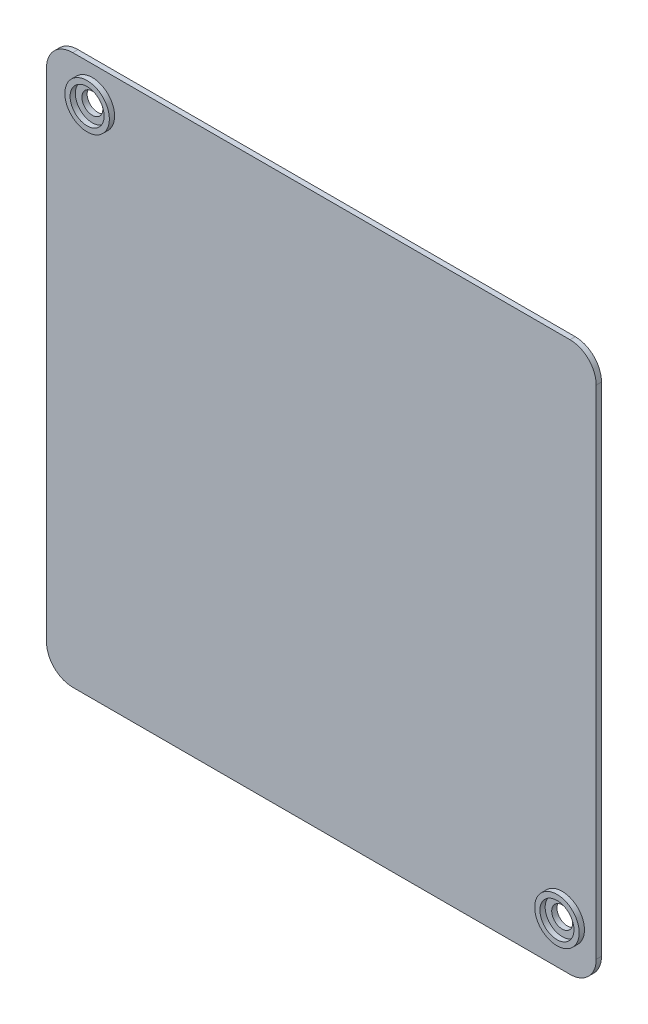
ISO-10303-21;
HEADER;
FILE_DESCRIPTION(('STEP AP214'),'2;1');
FILE_NAME('part.step','',(''),(''),'','','');
FILE_SCHEMA(('AUTOMOTIVE_DESIGN { 1 0 10303 214 1 1 1 1 }'));
ENDSEC;
DATA;
#1=APPLICATION_CONTEXT('core data for automotive mechanical design processes');
#2=APPLICATION_PROTOCOL_DEFINITION('international standard','automotive_design',2000,#1);
#3=PRODUCT_CONTEXT('',#1,'mechanical');
#4=PRODUCT('Part','Part','',(#3));
#5=PRODUCT_RELATED_PRODUCT_CATEGORY('part','',(#4));
#6=PRODUCT_DEFINITION_FORMATION('','',#4);
#7=PRODUCT_DEFINITION_CONTEXT('part definition',#1,'design');
#8=PRODUCT_DEFINITION('design','',#6,#7);
#9=PRODUCT_DEFINITION_SHAPE('','',#8);
#10=(LENGTH_UNIT() NAMED_UNIT(*) SI_UNIT(.MILLI.,.METRE.));
#11=(NAMED_UNIT(*) PLANE_ANGLE_UNIT() SI_UNIT($,.RADIAN.));
#12=(NAMED_UNIT(*) SI_UNIT($,.STERADIAN.) SOLID_ANGLE_UNIT());
#13=UNCERTAINTY_MEASURE_WITH_UNIT(LENGTH_MEASURE(1.E-05),#10,'distance_accuracy_value','');
#14=(GEOMETRIC_REPRESENTATION_CONTEXT(3) GLOBAL_UNCERTAINTY_ASSIGNED_CONTEXT((#13)) GLOBAL_UNIT_ASSIGNED_CONTEXT((#10,
#11,#12)) REPRESENTATION_CONTEXT('',''));
#15=CARTESIAN_POINT('',(0.,0.,0.));
#16=DIRECTION('',(0.,0.,1.));
#17=DIRECTION('',(1.,0.,0.));
#18=AXIS2_PLACEMENT_3D('',#15,#16,#17);
#19=CARTESIAN_POINT('',(0.,0.,1.));
#20=DIRECTION('',(0.,0.,1.));
#21=DIRECTION('',(1.,0.,0.));
#22=AXIS2_PLACEMENT_3D('',#19,#20,#21);
#23=PLANE('',#22);
#24=CARTESIAN_POINT('',(46.,-43.75,1.));
#25=DIRECTION('',(0.,0.,1.));
#26=DIRECTION('',(1.,0.,0.));
#27=AXIS2_PLACEMENT_3D('',#24,#25,#26);
#28=CIRCLE('',#27,2.00000000000001);
#29=CARTESIAN_POINT('',(48.,-43.75,1.));
#30=VERTEX_POINT('',#29);
#31=EDGE_CURVE('E170',#30,#30,#28,.F.);
#32=ORIENTED_EDGE('',*,*,#31,.T.);
#33=EDGE_LOOP('',(#32));
#34=FACE_BOUND('',#33,.T.);
#35=CARTESIAN_POINT('',(46.,-43.75,1.));
#36=DIRECTION('',(0.,0.,1.));
#37=DIRECTION('',(1.,0.,0.));
#38=AXIS2_PLACEMENT_3D('',#35,#36,#37);
#39=CIRCLE('',#38,3.25);
#40=CARTESIAN_POINT('',(49.25,-43.75,1.));
#41=VERTEX_POINT('',#40);
#42=EDGE_CURVE('E236',#41,#41,#39,.T.);
#43=ORIENTED_EDGE('',*,*,#42,.T.);
#44=EDGE_LOOP('',(#43));
#45=FACE_BOUND('',#44,.T.);
#46=ADVANCED_FACE('F35',(#34,#45),#23,.T.);
#47=CARTESIAN_POINT('',(-43.75,46.,1.));
#48=DIRECTION('',(0.,0.,1.));
#49=DIRECTION('',(1.,0.,0.));
#50=AXIS2_PLACEMENT_3D('',#47,#48,#49);
#51=CIRCLE('',#50,2.);
#52=CARTESIAN_POINT('',(-41.75,46.,1.));
#53=VERTEX_POINT('',#52);
#54=EDGE_CURVE('E173',#53,#53,#51,.T.);
#55=ORIENTED_EDGE('',*,*,#54,.F.);
#56=EDGE_LOOP('',(#55));
#57=FACE_BOUND('',#56,.T.);
#58=CARTESIAN_POINT('',(-43.75,46.,1.));
#59=DIRECTION('',(0.,0.,1.));
#60=DIRECTION('',(1.,0.,0.));
#61=AXIS2_PLACEMENT_3D('',#58,#59,#60);
#62=CIRCLE('',#61,3.25);
#63=CARTESIAN_POINT('',(-40.5,46.,1.));
#64=VERTEX_POINT('',#63);
#65=EDGE_CURVE('E130',#64,#64,#62,.F.);
#66=ORIENTED_EDGE('',*,*,#65,.F.);
#67=EDGE_LOOP('',(#66));
#68=FACE_BOUND('',#67,.T.);
#69=ADVANCED_FACE('F201',(#57,#68),#23,.T.);
#70=CARTESIAN_POINT('',(52.5,0.,1.));
#71=DIRECTION('',(1.,0.,0.));
#72=DIRECTION('',(0.,1.,0.));
#73=AXIS2_PLACEMENT_3D('',#70,#71,#72);
#74=PLANE('',#73);
#75=DIRECTION('',(0.,-1.,0.));
#76=VECTOR('',#75,1.);
#77=CARTESIAN_POINT('',(52.5,0.,1.));
#78=LINE('',#77,#76);
#79=CARTESIAN_POINT('',(52.5,47.5,1.));
#80=VERTEX_POINT('',#79);
#81=CARTESIAN_POINT('',(52.5,-47.5,1.));
#82=VERTEX_POINT('',#81);
#83=EDGE_CURVE('E161',#80,#82,#78,.T.);
#84=ORIENTED_EDGE('',*,*,#83,.T.);
#85=DIRECTION('',(0.,0.,-1.));
#86=VECTOR('',#85,1.);
#87=CARTESIAN_POINT('',(52.5,-47.5,0.));
#88=LINE('',#87,#86);
#89=CARTESIAN_POINT('',(52.5,-47.5,0.));
#90=VERTEX_POINT('',#89);
#91=EDGE_CURVE('E113',#82,#90,#88,.T.);
#92=ORIENTED_EDGE('',*,*,#91,.T.);
#93=DIRECTION('',(0.,-1.,0.));
#94=VECTOR('',#93,1.);
#95=CARTESIAN_POINT('',(52.5,0.,0.));
#96=LINE('',#95,#94);
#97=CARTESIAN_POINT('',(52.5,47.5,0.));
#98=VERTEX_POINT('',#97);
#99=EDGE_CURVE('E105',#98,#90,#96,.T.);
#100=ORIENTED_EDGE('',*,*,#99,.F.);
#101=DIRECTION('',(0.,0.,-1.));
#102=VECTOR('',#101,1.);
#103=CARTESIAN_POINT('',(52.5,47.5,1.));
#104=LINE('',#103,#102);
#105=EDGE_CURVE('E119',#98,#80,#104,.F.);
#106=ORIENTED_EDGE('',*,*,#105,.T.);
#107=EDGE_LOOP('',(#84,#92,#100,#106));
#108=FACE_BOUND('',#107,.T.);
#109=ADVANCED_FACE('F118',(#108),#74,.T.);
#110=CARTESIAN_POINT('',(0.,52.5,1.));
#111=DIRECTION('',(0.,1.,0.));
#112=DIRECTION('',(0.,0.,1.));
#113=AXIS2_PLACEMENT_3D('',#110,#111,#112);
#114=PLANE('',#113);
#115=DIRECTION('',(1.,0.,0.));
#116=VECTOR('',#115,1.);
#117=CARTESIAN_POINT('',(0.,52.5,0.));
#118=LINE('',#117,#116);
#119=CARTESIAN_POINT('',(-47.5,52.5,0.));
#120=VERTEX_POINT('',#119);
#121=CARTESIAN_POINT('',(47.5,52.5,0.));
#122=VERTEX_POINT('',#121);
#123=EDGE_CURVE('E107',#120,#122,#118,.T.);
#124=ORIENTED_EDGE('',*,*,#123,.F.);
#125=DIRECTION('',(0.,0.,-1.));
#126=VECTOR('',#125,1.);
#127=CARTESIAN_POINT('',(-47.5,52.5,1.));
#128=LINE('',#127,#126);
#129=CARTESIAN_POINT('',(-47.5,52.5,1.));
#130=VERTEX_POINT('',#129);
#131=EDGE_CURVE('E11',#120,#130,#128,.F.);
#132=ORIENTED_EDGE('',*,*,#131,.T.);
#133=DIRECTION('',(1.,0.,0.));
#134=VECTOR('',#133,1.);
#135=CARTESIAN_POINT('',(0.,52.5,1.));
#136=LINE('',#135,#134);
#137=CARTESIAN_POINT('',(47.5,52.5,1.));
#138=VERTEX_POINT('',#137);
#139=EDGE_CURVE('E159',#130,#138,#136,.T.);
#140=ORIENTED_EDGE('',*,*,#139,.T.);
#141=DIRECTION('',(0.,0.,-1.));
#142=VECTOR('',#141,1.);
#143=CARTESIAN_POINT('',(47.5,52.5,1.));
#144=LINE('',#143,#142);
#145=EDGE_CURVE('E43',#138,#122,#144,.T.);
#146=ORIENTED_EDGE('',*,*,#145,.T.);
#147=EDGE_LOOP('',(#124,#132,#140,#146));
#148=FACE_BOUND('',#147,.T.);
#149=ADVANCED_FACE('F157',(#148),#114,.T.);
#150=CARTESIAN_POINT('',(-52.5,0.,1.));
#151=DIRECTION('',(1.,0.,0.));
#152=DIRECTION('',(0.,1.,0.));
#153=AXIS2_PLACEMENT_3D('',#150,#151,#152);
#154=PLANE('',#153);
#155=DIRECTION('',(0.,-1.,0.));
#156=VECTOR('',#155,1.);
#157=CARTESIAN_POINT('',(-52.5,0.,0.));
#158=LINE('',#157,#156);
#159=CARTESIAN_POINT('',(-52.5,47.5,0.));
#160=VERTEX_POINT('',#159);
#161=CARTESIAN_POINT('',(-52.5,-47.5,0.));
#162=VERTEX_POINT('',#161);
#163=EDGE_CURVE('E177',#160,#162,#158,.T.);
#164=ORIENTED_EDGE('',*,*,#163,.T.);
#165=DIRECTION('',(0.,0.,-1.));
#166=VECTOR('',#165,1.);
#167=CARTESIAN_POINT('',(-52.5,-47.5,1.));
#168=LINE('',#167,#166);
#169=CARTESIAN_POINT('',(-52.5,-47.5,1.));
#170=VERTEX_POINT('',#169);
#171=EDGE_CURVE('E50',#162,#170,#168,.F.);
#172=ORIENTED_EDGE('',*,*,#171,.T.);
#173=DIRECTION('',(0.,-1.,0.));
#174=VECTOR('',#173,1.);
#175=CARTESIAN_POINT('',(-52.5,0.,1.));
#176=LINE('',#175,#174);
#177=CARTESIAN_POINT('',(-52.5,47.5,1.));
#178=VERTEX_POINT('',#177);
#179=EDGE_CURVE('E160',#178,#170,#176,.T.);
#180=ORIENTED_EDGE('',*,*,#179,.F.);
#181=DIRECTION('',(0.,0.,-1.));
#182=VECTOR('',#181,1.);
#183=CARTESIAN_POINT('',(-52.5,47.5,0.));
#184=LINE('',#183,#182);
#185=EDGE_CURVE('E152',#178,#160,#184,.T.);
#186=ORIENTED_EDGE('',*,*,#185,.T.);
#187=EDGE_LOOP('',(#164,#172,#180,#186));
#188=FACE_BOUND('',#187,.T.);
#189=ADVANCED_FACE('F299',(#188),#154,.F.);
#190=CARTESIAN_POINT('',(46.,-43.75,1.));
#191=DIRECTION('',(0.,0.,-1.));
#192=DIRECTION('',(-1.,0.,0.));
#193=AXIS2_PLACEMENT_3D('',#190,#191,#192);
#194=CYLINDRICAL_SURFACE('',#193,2.00000000000001);
#195=ORIENTED_EDGE('',*,*,#31,.F.);
#196=EDGE_LOOP('',(#195));
#197=FACE_BOUND('',#196,.T.);
#198=CARTESIAN_POINT('',(46.,-43.75,0.));
#199=DIRECTION('',(0.,0.,1.));
#200=DIRECTION('',(1.,0.,0.));
#201=AXIS2_PLACEMENT_3D('',#198,#199,#200);
#202=CIRCLE('',#201,2.00000000000001);
#203=CARTESIAN_POINT('',(48.,-43.75,0.));
#204=VERTEX_POINT('',#203);
#205=EDGE_CURVE('E181',#204,#204,#202,.F.);
#206=ORIENTED_EDGE('',*,*,#205,.T.);
#207=EDGE_LOOP('',(#206));
#208=FACE_BOUND('',#207,.T.);
#209=ADVANCED_FACE('F202',(#197,#208),#194,.F.);
#210=CARTESIAN_POINT('',(0.,-52.5,1.));
#211=DIRECTION('',(0.,1.,0.));
#212=DIRECTION('',(0.,0.,1.));
#213=AXIS2_PLACEMENT_3D('',#210,#211,#212);
#214=PLANE('',#213);
#215=DIRECTION('',(1.,0.,0.));
#216=VECTOR('',#215,1.);
#217=CARTESIAN_POINT('',(0.,-52.5,0.));
#218=LINE('',#217,#216);
#219=CARTESIAN_POINT('',(-47.5,-52.5,0.));
#220=VERTEX_POINT('',#219);
#221=CARTESIAN_POINT('',(47.5,-52.5,0.));
#222=VERTEX_POINT('',#221);
#223=EDGE_CURVE('E179',#220,#222,#218,.T.);
#224=ORIENTED_EDGE('',*,*,#223,.T.);
#225=DIRECTION('',(0.,0.,-1.));
#226=VECTOR('',#225,1.);
#227=CARTESIAN_POINT('',(47.5,-52.5,1.));
#228=LINE('',#227,#226);
#229=CARTESIAN_POINT('',(47.5,-52.5,1.));
#230=VERTEX_POINT('',#229);
#231=EDGE_CURVE('E144',#222,#230,#228,.F.);
#232=ORIENTED_EDGE('',*,*,#231,.T.);
#233=DIRECTION('',(1.,0.,0.));
#234=VECTOR('',#233,1.);
#235=CARTESIAN_POINT('',(0.,-52.5,1.));
#236=LINE('',#235,#234);
#237=CARTESIAN_POINT('',(-47.5,-52.5,1.));
#238=VERTEX_POINT('',#237);
#239=EDGE_CURVE('E163',#238,#230,#236,.T.);
#240=ORIENTED_EDGE('',*,*,#239,.F.);
#241=DIRECTION('',(0.,0.,-1.));
#242=VECTOR('',#241,1.);
#243=CARTESIAN_POINT('',(-47.5,-52.5,1.));
#244=LINE('',#243,#242);
#245=EDGE_CURVE('E141',#238,#220,#244,.T.);
#246=ORIENTED_EDGE('',*,*,#245,.T.);
#247=EDGE_LOOP('',(#224,#232,#240,#246));
#248=FACE_BOUND('',#247,.T.);
#249=ADVANCED_FACE('F192',(#248),#214,.F.);
#250=CARTESIAN_POINT('',(-43.75,46.,1.));
#251=DIRECTION('',(0.,0.,-1.));
#252=DIRECTION('',(-1.,0.,0.));
#253=AXIS2_PLACEMENT_3D('',#250,#251,#252);
#254=CYLINDRICAL_SURFACE('',#253,2.);
#255=ORIENTED_EDGE('',*,*,#54,.T.);
#256=EDGE_LOOP('',(#255));
#257=FACE_BOUND('',#256,.T.);
#258=CARTESIAN_POINT('',(-43.75,46.,0.));
#259=DIRECTION('',(0.,0.,1.));
#260=DIRECTION('',(1.,0.,0.));
#261=AXIS2_PLACEMENT_3D('',#258,#259,#260);
#262=CIRCLE('',#261,2.);
#263=CARTESIAN_POINT('',(-41.75,46.,0.));
#264=VERTEX_POINT('',#263);
#265=EDGE_CURVE('E133',#264,#264,#262,.T.);
#266=ORIENTED_EDGE('',*,*,#265,.F.);
#267=EDGE_LOOP('',(#266));
#268=FACE_BOUND('',#267,.T.);
#269=ADVANCED_FACE('F189',(#257,#268),#254,.F.);
#270=CARTESIAN_POINT('',(46.,-43.75,1.));
#271=DIRECTION('',(0.,0.,1.));
#272=DIRECTION('',(1.,0.,0.));
#273=AXIS2_PLACEMENT_3D('',#270,#271,#272);
#274=CIRCLE('',#273,4.25000000000004);
#275=CARTESIAN_POINT('',(50.25,-43.75,1.));
#276=VERTEX_POINT('',#275);
#277=EDGE_CURVE('E126',#276,#276,#274,.T.);
#278=ORIENTED_EDGE('',*,*,#277,.F.);
#279=EDGE_LOOP('',(#278));
#280=FACE_BOUND('',#279,.T.);
#281=CARTESIAN_POINT('',(-43.75,46.,1.));
#282=DIRECTION('',(0.,0.,1.));
#283=DIRECTION('',(1.,0.,0.));
#284=AXIS2_PLACEMENT_3D('',#281,#282,#283);
#285=CIRCLE('',#284,4.25000000000001);
#286=CARTESIAN_POINT('',(-39.5,46.,1.));
#287=VERTEX_POINT('',#286);
#288=EDGE_CURVE('E122',#287,#287,#285,.F.);
#289=ORIENTED_EDGE('',*,*,#288,.T.);
#290=EDGE_LOOP('',(#289));
#291=FACE_BOUND('',#290,.T.);
#292=ORIENTED_EDGE('',*,*,#239,.T.);
#293=CARTESIAN_POINT('',(47.5,-47.5,1.));
#294=DIRECTION('',(0.,0.,1.));
#295=DIRECTION('',(1.,0.,0.));
#296=AXIS2_PLACEMENT_3D('',#293,#294,#295);
#297=CIRCLE('',#296,5.);
#298=EDGE_CURVE('E150',#230,#82,#297,.T.);
#299=ORIENTED_EDGE('',*,*,#298,.T.);
#300=ORIENTED_EDGE('',*,*,#83,.F.);
#301=CARTESIAN_POINT('',(47.5,47.5,1.));
#302=DIRECTION('',(0.,0.,1.));
#303=DIRECTION('',(1.,0.,0.));
#304=AXIS2_PLACEMENT_3D('',#301,#302,#303);
#305=CIRCLE('',#304,5.);
#306=EDGE_CURVE('E125',#80,#138,#305,.T.);
#307=ORIENTED_EDGE('',*,*,#306,.T.);
#308=ORIENTED_EDGE('',*,*,#139,.F.);
#309=CARTESIAN_POINT('',(-47.5,47.5,1.));
#310=DIRECTION('',(0.,0.,1.));
#311=DIRECTION('',(1.,0.,0.));
#312=AXIS2_PLACEMENT_3D('',#309,#310,#311);
#313=CIRCLE('',#312,5.);
#314=EDGE_CURVE('E57',#130,#178,#313,.T.);
#315=ORIENTED_EDGE('',*,*,#314,.T.);
#316=ORIENTED_EDGE('',*,*,#179,.T.);
#317=CARTESIAN_POINT('',(-47.5,-47.5,1.));
#318=DIRECTION('',(0.,0.,1.));
#319=DIRECTION('',(1.,0.,0.));
#320=AXIS2_PLACEMENT_3D('',#317,#318,#319);
#321=CIRCLE('',#320,5.);
#322=EDGE_CURVE('E148',#170,#238,#321,.T.);
#323=ORIENTED_EDGE('',*,*,#322,.T.);
#324=EDGE_LOOP('',(#292,#299,#300,#307,#308,#315,#316,#323));
#325=FACE_BOUND('',#324,.T.);
#326=ADVANCED_FACE('F191',(#280,#291,#325),#23,.T.);
#327=CARTESIAN_POINT('',(0.,0.,0.));
#328=DIRECTION('',(0.,0.,1.));
#329=DIRECTION('',(1.,0.,0.));
#330=AXIS2_PLACEMENT_3D('',#327,#328,#329);
#331=PLANE('',#330);
#332=ORIENTED_EDGE('',*,*,#99,.T.);
#333=CARTESIAN_POINT('',(47.5,-47.5,0.));
#334=DIRECTION('',(0.,0.,1.));
#335=DIRECTION('',(1.,0.,0.));
#336=AXIS2_PLACEMENT_3D('',#333,#334,#335);
#337=CIRCLE('',#336,5.);
#338=EDGE_CURVE('E139',#90,#222,#337,.F.);
#339=ORIENTED_EDGE('',*,*,#338,.T.);
#340=ORIENTED_EDGE('',*,*,#223,.F.);
#341=CARTESIAN_POINT('',(-47.5,-47.5,0.));
#342=DIRECTION('',(0.,0.,1.));
#343=DIRECTION('',(1.,0.,0.));
#344=AXIS2_PLACEMENT_3D('',#341,#342,#343);
#345=CIRCLE('',#344,5.);
#346=EDGE_CURVE('E137',#220,#162,#345,.F.);
#347=ORIENTED_EDGE('',*,*,#346,.T.);
#348=ORIENTED_EDGE('',*,*,#163,.F.);
#349=CARTESIAN_POINT('',(-47.5,47.5,0.));
#350=DIRECTION('',(0.,0.,1.));
#351=DIRECTION('',(1.,0.,0.));
#352=AXIS2_PLACEMENT_3D('',#349,#350,#351);
#353=CIRCLE('',#352,5.);
#354=EDGE_CURVE('E112',#160,#120,#353,.F.);
#355=ORIENTED_EDGE('',*,*,#354,.T.);
#356=ORIENTED_EDGE('',*,*,#123,.T.);
#357=CARTESIAN_POINT('',(47.5,47.5,0.));
#358=DIRECTION('',(0.,0.,1.));
#359=DIRECTION('',(1.,0.,0.));
#360=AXIS2_PLACEMENT_3D('',#357,#358,#359);
#361=CIRCLE('',#360,5.);
#362=EDGE_CURVE('E101',#122,#98,#361,.F.);
#363=ORIENTED_EDGE('',*,*,#362,.T.);
#364=EDGE_LOOP('',(#332,#339,#340,#347,#348,#355,#356,#363));
#365=FACE_BOUND('',#364,.T.);
#366=ORIENTED_EDGE('',*,*,#265,.T.);
#367=EDGE_LOOP('',(#366));
#368=FACE_BOUND('',#367,.T.);
#369=ORIENTED_EDGE('',*,*,#205,.F.);
#370=EDGE_LOOP('',(#369));
#371=FACE_BOUND('',#370,.T.);
#372=ADVANCED_FACE('F103',(#365,#368,#371),#331,.F.);
#373=CARTESIAN_POINT('',(-43.75,46.,2.));
#374=DIRECTION('',(0.,0.,-1.));
#375=DIRECTION('',(-1.,0.,0.));
#376=AXIS2_PLACEMENT_3D('',#373,#374,#375);
#377=CYLINDRICAL_SURFACE('',#376,3.25);
#378=ORIENTED_EDGE('',*,*,#65,.T.);
#379=EDGE_LOOP('',(#378));
#380=FACE_BOUND('',#379,.T.);
#381=CARTESIAN_POINT('',(-43.75,46.,2.));
#382=DIRECTION('',(0.,0.,1.));
#383=DIRECTION('',(1.,0.,0.));
#384=AXIS2_PLACEMENT_3D('',#381,#382,#383);
#385=CIRCLE('',#384,3.25);
#386=CARTESIAN_POINT('',(-40.5,46.,2.));
#387=VERTEX_POINT('',#386);
#388=EDGE_CURVE('E233',#387,#387,#385,.T.);
#389=ORIENTED_EDGE('',*,*,#388,.T.);
#390=EDGE_LOOP('',(#389));
#391=FACE_BOUND('',#390,.T.);
#392=ADVANCED_FACE('F215',(#380,#391),#377,.F.);
#393=CARTESIAN_POINT('',(-43.75,46.,2.));
#394=DIRECTION('',(0.,0.,-1.));
#395=DIRECTION('',(-1.,0.,0.));
#396=AXIS2_PLACEMENT_3D('',#393,#394,#395);
#397=CYLINDRICAL_SURFACE('',#396,4.25000000000001);
#398=ORIENTED_EDGE('',*,*,#288,.F.);
#399=EDGE_LOOP('',(#398));
#400=FACE_BOUND('',#399,.T.);
#401=CARTESIAN_POINT('',(-43.75,46.,2.));
#402=DIRECTION('',(0.,0.,1.));
#403=DIRECTION('',(1.,0.,0.));
#404=AXIS2_PLACEMENT_3D('',#401,#402,#403);
#405=CIRCLE('',#404,4.25000000000001);
#406=CARTESIAN_POINT('',(-39.5,46.,2.));
#407=VERTEX_POINT('',#406);
#408=EDGE_CURVE('E235',#407,#407,#405,.T.);
#409=ORIENTED_EDGE('',*,*,#408,.F.);
#410=EDGE_LOOP('',(#409));
#411=FACE_BOUND('',#410,.T.);
#412=ADVANCED_FACE('F221',(#400,#411),#397,.T.);
#413=CARTESIAN_POINT('',(0.,0.,2.));
#414=DIRECTION('',(0.,0.,1.));
#415=DIRECTION('',(1.,0.,0.));
#416=AXIS2_PLACEMENT_3D('',#413,#414,#415);
#417=PLANE('',#416);
#418=ORIENTED_EDGE('',*,*,#388,.F.);
#419=EDGE_LOOP('',(#418));
#420=FACE_BOUND('',#419,.T.);
#421=ORIENTED_EDGE('',*,*,#408,.T.);
#422=EDGE_LOOP('',(#421));
#423=FACE_BOUND('',#422,.T.);
#424=ADVANCED_FACE('F226',(#420,#423),#417,.T.);
#425=CARTESIAN_POINT('',(46.,-43.75,2.));
#426=DIRECTION('',(0.,0.,-1.));
#427=DIRECTION('',(-1.,0.,0.));
#428=AXIS2_PLACEMENT_3D('',#425,#426,#427);
#429=CYLINDRICAL_SURFACE('',#428,4.25000000000004);
#430=ORIENTED_EDGE('',*,*,#277,.T.);
#431=EDGE_LOOP('',(#430));
#432=FACE_BOUND('',#431,.T.);
#433=CARTESIAN_POINT('',(46.,-43.75,2.));
#434=DIRECTION('',(0.,0.,1.));
#435=DIRECTION('',(1.,0.,0.));
#436=AXIS2_PLACEMENT_3D('',#433,#434,#435);
#437=CIRCLE('',#436,4.25000000000004);
#438=CARTESIAN_POINT('',(50.25,-43.75,2.));
#439=VERTEX_POINT('',#438);
#440=EDGE_CURVE('E276',#439,#439,#437,.F.);
#441=ORIENTED_EDGE('',*,*,#440,.T.);
#442=EDGE_LOOP('',(#441));
#443=FACE_BOUND('',#442,.T.);
#444=ADVANCED_FACE('F251',(#432,#443),#429,.T.);
#445=CARTESIAN_POINT('',(46.,-43.75,2.));
#446=DIRECTION('',(0.,0.,-1.));
#447=DIRECTION('',(-1.,0.,0.));
#448=AXIS2_PLACEMENT_3D('',#445,#446,#447);
#449=CYLINDRICAL_SURFACE('',#448,3.25);
#450=ORIENTED_EDGE('',*,*,#42,.F.);
#451=EDGE_LOOP('',(#450));
#452=FACE_BOUND('',#451,.T.);
#453=CARTESIAN_POINT('',(46.,-43.75,2.));
#454=DIRECTION('',(0.,0.,1.));
#455=DIRECTION('',(1.,0.,0.));
#456=AXIS2_PLACEMENT_3D('',#453,#454,#455);
#457=CIRCLE('',#456,3.25);
#458=CARTESIAN_POINT('',(49.25,-43.75,2.));
#459=VERTEX_POINT('',#458);
#460=EDGE_CURVE('E241',#459,#459,#457,.F.);
#461=ORIENTED_EDGE('',*,*,#460,.F.);
#462=EDGE_LOOP('',(#461));
#463=FACE_BOUND('',#462,.T.);
#464=ADVANCED_FACE('F256',(#452,#463),#449,.F.);
#465=CARTESIAN_POINT('',(0.,0.,2.));
#466=DIRECTION('',(0.,0.,1.));
#467=DIRECTION('',(1.,0.,0.));
#468=AXIS2_PLACEMENT_3D('',#465,#466,#467);
#469=PLANE('',#468);
#470=ORIENTED_EDGE('',*,*,#440,.F.);
#471=EDGE_LOOP('',(#470));
#472=FACE_BOUND('',#471,.T.);
#473=ORIENTED_EDGE('',*,*,#460,.T.);
#474=EDGE_LOOP('',(#473));
#475=FACE_BOUND('',#474,.T.);
#476=ADVANCED_FACE('F262',(#472,#475),#469,.T.);
#477=CARTESIAN_POINT('',(47.5,-47.5,1.));
#478=DIRECTION('',(0.,0.,1.));
#479=DIRECTION('',(1.,0.,0.));
#480=AXIS2_PLACEMENT_3D('',#477,#478,#479);
#481=CYLINDRICAL_SURFACE('',#480,5.);
#482=ORIENTED_EDGE('',*,*,#298,.F.);
#483=ORIENTED_EDGE('',*,*,#231,.F.);
#484=ORIENTED_EDGE('',*,*,#338,.F.);
#485=ORIENTED_EDGE('',*,*,#91,.F.);
#486=EDGE_LOOP('',(#482,#483,#484,#485));
#487=FACE_BOUND('',#486,.T.);
#488=ADVANCED_FACE('F265',(#487),#481,.T.);
#489=CARTESIAN_POINT('',(-47.5,-47.5,1.));
#490=DIRECTION('',(0.,0.,-1.));
#491=DIRECTION('',(-1.,0.,0.));
#492=AXIS2_PLACEMENT_3D('',#489,#490,#491);
#493=CYLINDRICAL_SURFACE('',#492,5.);
#494=ORIENTED_EDGE('',*,*,#322,.F.);
#495=ORIENTED_EDGE('',*,*,#171,.F.);
#496=ORIENTED_EDGE('',*,*,#346,.F.);
#497=ORIENTED_EDGE('',*,*,#245,.F.);
#498=EDGE_LOOP('',(#494,#495,#496,#497));
#499=FACE_BOUND('',#498,.T.);
#500=ADVANCED_FACE('F270',(#499),#493,.T.);
#501=CARTESIAN_POINT('',(-47.5,47.5,1.));
#502=DIRECTION('',(0.,0.,1.));
#503=DIRECTION('',(1.,0.,0.));
#504=AXIS2_PLACEMENT_3D('',#501,#502,#503);
#505=CYLINDRICAL_SURFACE('',#504,5.);
#506=ORIENTED_EDGE('',*,*,#314,.F.);
#507=ORIENTED_EDGE('',*,*,#131,.F.);
#508=ORIENTED_EDGE('',*,*,#354,.F.);
#509=ORIENTED_EDGE('',*,*,#185,.F.);
#510=EDGE_LOOP('',(#506,#507,#508,#509));
#511=FACE_BOUND('',#510,.T.);
#512=ADVANCED_FACE('F286',(#511),#505,.T.);
#513=CARTESIAN_POINT('',(47.5,47.5,1.));
#514=DIRECTION('',(0.,0.,-1.));
#515=DIRECTION('',(-1.,0.,0.));
#516=AXIS2_PLACEMENT_3D('',#513,#514,#515);
#517=CYLINDRICAL_SURFACE('',#516,5.);
#518=ORIENTED_EDGE('',*,*,#306,.F.);
#519=ORIENTED_EDGE('',*,*,#105,.F.);
#520=ORIENTED_EDGE('',*,*,#362,.F.);
#521=ORIENTED_EDGE('',*,*,#145,.F.);
#522=EDGE_LOOP('',(#518,#519,#520,#521));
#523=FACE_BOUND('',#522,.T.);
#524=ADVANCED_FACE('F37',(#523),#517,.T.);
#525=CLOSED_SHELL('',(#46,#69,#109,#149,#189,#209,#249,#269,#326,#372,#392,#412,#424,#444,#464,
#476,#488,#500,#512,#524));
#526=MANIFOLD_SOLID_BREP('B2',#525);
#527=ADVANCED_BREP_SHAPE_REPRESENTATION('',(#18,#526),#14);
#528=SHAPE_DEFINITION_REPRESENTATION(#9,#527);
ENDSEC;
END-ISO-10303-21;
